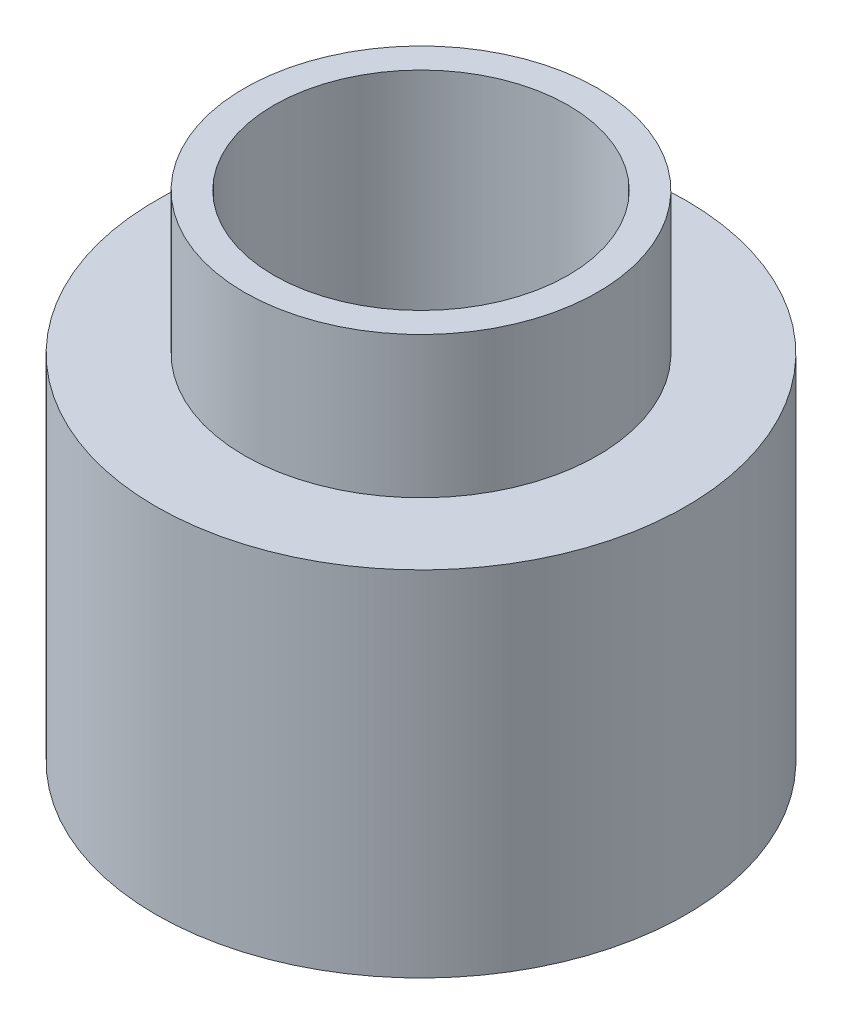
ISO-10303-21;
HEADER;
FILE_DESCRIPTION(('STEP AP214'),'2;1');
FILE_NAME('part.step','',(''),(''),'','','');
FILE_SCHEMA(('AUTOMOTIVE_DESIGN { 1 0 10303 214 1 1 1 1 }'));
ENDSEC;
DATA;
#1=APPLICATION_CONTEXT('core data for automotive mechanical design processes');
#2=APPLICATION_PROTOCOL_DEFINITION('international standard','automotive_design',2000,#1);
#3=PRODUCT_CONTEXT('',#1,'mechanical');
#4=PRODUCT('Part','Part','',(#3));
#5=PRODUCT_RELATED_PRODUCT_CATEGORY('part','',(#4));
#6=PRODUCT_DEFINITION_FORMATION('','',#4);
#7=PRODUCT_DEFINITION_CONTEXT('part definition',#1,'design');
#8=PRODUCT_DEFINITION('design','',#6,#7);
#9=PRODUCT_DEFINITION_SHAPE('','',#8);
#10=(LENGTH_UNIT() NAMED_UNIT(*) SI_UNIT(.MILLI.,.METRE.));
#11=(NAMED_UNIT(*) PLANE_ANGLE_UNIT() SI_UNIT($,.RADIAN.));
#12=(NAMED_UNIT(*) SI_UNIT($,.STERADIAN.) SOLID_ANGLE_UNIT());
#13=UNCERTAINTY_MEASURE_WITH_UNIT(LENGTH_MEASURE(1.E-05),#10,'distance_accuracy_value','');
#14=(GEOMETRIC_REPRESENTATION_CONTEXT(3) GLOBAL_UNCERTAINTY_ASSIGNED_CONTEXT((#13)) GLOBAL_UNIT_ASSIGNED_CONTEXT((#10,
#11,#12)) REPRESENTATION_CONTEXT('',''));
#15=CARTESIAN_POINT('',(0.,0.,0.));
#16=DIRECTION('',(0.,0.,1.));
#17=DIRECTION('',(1.,0.,0.));
#18=AXIS2_PLACEMENT_3D('',#15,#16,#17);
#19=CARTESIAN_POINT('',(0.,3.,0.));
#20=DIRECTION('',(0.,1.,0.));
#21=DIRECTION('',(0.,0.,1.));
#22=AXIS2_PLACEMENT_3D('',#19,#20,#21);
#23=PLANE('',#22);
#24=CARTESIAN_POINT('',(0.,3.,0.));
#25=DIRECTION('',(0.,1.,0.));
#26=DIRECTION('',(0.,0.,1.));
#27=AXIS2_PLACEMENT_3D('',#24,#25,#26);
#28=CIRCLE('',#27,2.25);
#29=CARTESIAN_POINT('',(0.,3.,2.25));
#30=VERTEX_POINT('',#29);
#31=EDGE_CURVE('E10',#30,#30,#28,.T.);
#32=ORIENTED_EDGE('',*,*,#31,.T.);
#33=EDGE_LOOP('',(#32));
#34=FACE_BOUND('',#33,.T.);
#35=CARTESIAN_POINT('',(0.,3.,0.));
#36=DIRECTION('',(0.,1.,0.));
#37=DIRECTION('',(0.,0.,1.));
#38=AXIS2_PLACEMENT_3D('',#35,#36,#37);
#39=CIRCLE('',#38,1.5);
#40=CARTESIAN_POINT('',(0.,3.,1.5));
#41=VERTEX_POINT('',#40);
#42=EDGE_CURVE('E52',#41,#41,#39,.T.);
#43=ORIENTED_EDGE('',*,*,#42,.F.);
#44=EDGE_LOOP('',(#43));
#45=FACE_BOUND('',#44,.T.);
#46=ADVANCED_FACE('F36',(#34,#45),#23,.T.);
#47=CARTESIAN_POINT('',(0.,0.,0.));
#48=DIRECTION('',(0.,1.,0.));
#49=DIRECTION('',(0.,0.,1.));
#50=AXIS2_PLACEMENT_3D('',#47,#48,#49);
#51=PLANE('',#50);
#52=CARTESIAN_POINT('',(0.,0.,0.));
#53=DIRECTION('',(0.,1.,0.));
#54=DIRECTION('',(0.,0.,1.));
#55=AXIS2_PLACEMENT_3D('',#52,#53,#54);
#56=CIRCLE('',#55,2.25);
#57=CARTESIAN_POINT('',(0.,0.,2.25));
#58=VERTEX_POINT('',#57);
#59=EDGE_CURVE('E40',#58,#58,#56,.T.);
#60=ORIENTED_EDGE('',*,*,#59,.F.);
#61=EDGE_LOOP('',(#60));
#62=FACE_BOUND('',#61,.T.);
#63=CARTESIAN_POINT('',(0.,0.,0.));
#64=DIRECTION('',(0.,1.,0.));
#65=DIRECTION('',(0.,0.,1.));
#66=AXIS2_PLACEMENT_3D('',#63,#64,#65);
#67=CIRCLE('',#66,1.25);
#68=CARTESIAN_POINT('',(0.,0.,1.25));
#69=VERTEX_POINT('',#68);
#70=EDGE_CURVE('E47',#69,#69,#67,.T.);
#71=ORIENTED_EDGE('',*,*,#70,.T.);
#72=EDGE_LOOP('',(#71));
#73=FACE_BOUND('',#72,.T.);
#74=ADVANCED_FACE('F77',(#62,#73),#51,.F.);
#75=CARTESIAN_POINT('',(0.,3.,0.));
#76=DIRECTION('',(0.,-1.,0.));
#77=DIRECTION('',(0.,0.,-1.));
#78=AXIS2_PLACEMENT_3D('',#75,#76,#77);
#79=CYLINDRICAL_SURFACE('',#78,2.25);
#80=ORIENTED_EDGE('',*,*,#31,.F.);
#81=EDGE_LOOP('',(#80));
#82=FACE_BOUND('',#81,.T.);
#83=ORIENTED_EDGE('',*,*,#59,.T.);
#84=EDGE_LOOP('',(#83));
#85=FACE_BOUND('',#84,.T.);
#86=ADVANCED_FACE('F38',(#82,#85),#79,.T.);
#87=CARTESIAN_POINT('',(0.,3.,0.));
#88=DIRECTION('',(0.,-1.,0.));
#89=DIRECTION('',(0.,0.,-1.));
#90=AXIS2_PLACEMENT_3D('',#87,#88,#89);
#91=CYLINDRICAL_SURFACE('',#90,1.25);
#92=ORIENTED_EDGE('',*,*,#70,.F.);
#93=EDGE_LOOP('',(#92));
#94=FACE_BOUND('',#93,.T.);
#95=CARTESIAN_POINT('',(0.,4.2,0.));
#96=DIRECTION('',(0.,1.,0.));
#97=DIRECTION('',(0.,0.,1.));
#98=AXIS2_PLACEMENT_3D('',#95,#96,#97);
#99=CIRCLE('',#98,1.25);
#100=CARTESIAN_POINT('',(0.,4.2,1.25));
#101=VERTEX_POINT('',#100);
#102=EDGE_CURVE('E55',#101,#101,#99,.T.);
#103=ORIENTED_EDGE('',*,*,#102,.T.);
#104=EDGE_LOOP('',(#103));
#105=FACE_BOUND('',#104,.T.);
#106=ADVANCED_FACE('F61',(#94,#105),#91,.F.);
#107=CARTESIAN_POINT('',(0.,4.2,0.));
#108=DIRECTION('',(0.,1.,0.));
#109=DIRECTION('',(0.,0.,1.));
#110=AXIS2_PLACEMENT_3D('',#107,#108,#109);
#111=PLANE('',#110);
#112=CARTESIAN_POINT('',(0.,4.2,0.));
#113=DIRECTION('',(0.,1.,0.));
#114=DIRECTION('',(0.,0.,1.));
#115=AXIS2_PLACEMENT_3D('',#112,#113,#114);
#116=CIRCLE('',#115,1.5);
#117=CARTESIAN_POINT('',(0.,4.2,1.5));
#118=VERTEX_POINT('',#117);
#119=EDGE_CURVE('E51',#118,#118,#116,.T.);
#120=ORIENTED_EDGE('',*,*,#119,.T.);
#121=EDGE_LOOP('',(#120));
#122=FACE_BOUND('',#121,.T.);
#123=ORIENTED_EDGE('',*,*,#102,.F.);
#124=EDGE_LOOP('',(#123));
#125=FACE_BOUND('',#124,.T.);
#126=ADVANCED_FACE('F63',(#122,#125),#111,.T.);
#127=CARTESIAN_POINT('',(0.,4.2,0.));
#128=DIRECTION('',(0.,-1.,0.));
#129=DIRECTION('',(0.,0.,-1.));
#130=AXIS2_PLACEMENT_3D('',#127,#128,#129);
#131=CYLINDRICAL_SURFACE('',#130,1.5);
#132=ORIENTED_EDGE('',*,*,#119,.F.);
#133=EDGE_LOOP('',(#132));
#134=FACE_BOUND('',#133,.T.);
#135=ORIENTED_EDGE('',*,*,#42,.T.);
#136=EDGE_LOOP('',(#135));
#137=FACE_BOUND('',#136,.T.);
#138=ADVANCED_FACE('F65',(#134,#137),#131,.T.);
#139=CLOSED_SHELL('',(#46,#74,#86,#106,#126,#138));
#140=MANIFOLD_SOLID_BREP('B2',#139);
#141=ADVANCED_BREP_SHAPE_REPRESENTATION('',(#18,#140),#14);
#142=SHAPE_DEFINITION_REPRESENTATION(#9,#141);
ENDSEC;
END-ISO-10303-21;
